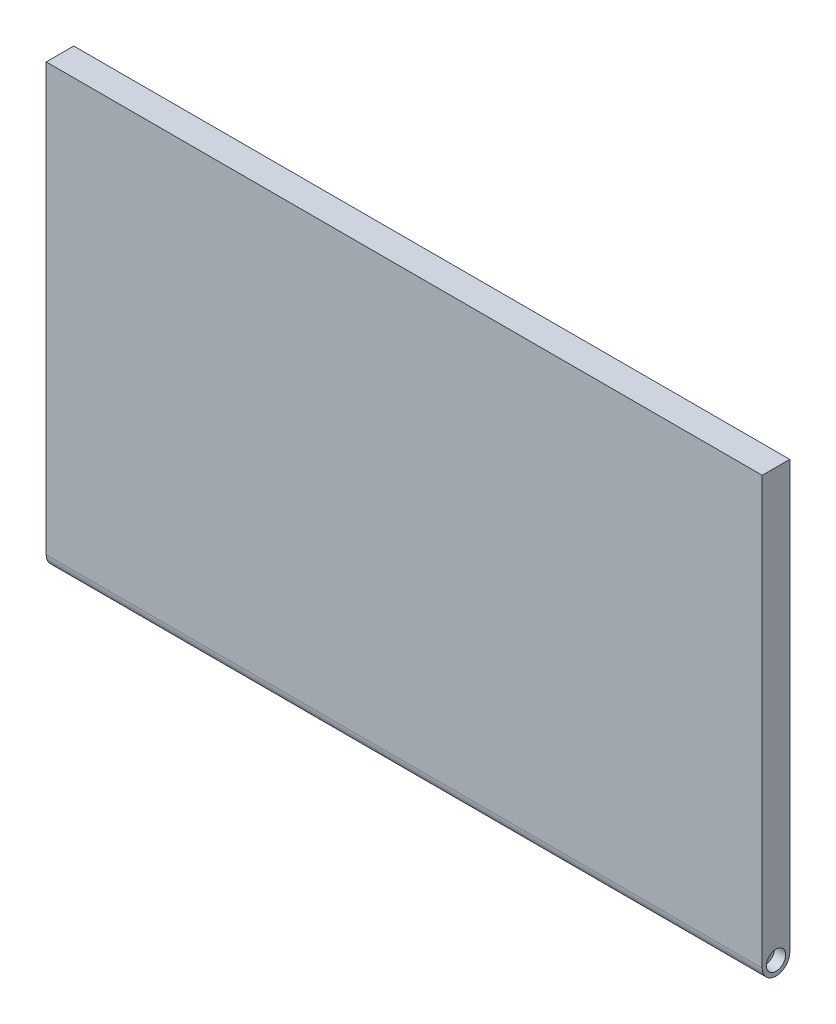
ISO-10303-21;
HEADER;
FILE_DESCRIPTION(('STEP AP214'),'2;1');
FILE_NAME('part.step','',(''),(''),'','','');
FILE_SCHEMA(('AUTOMOTIVE_DESIGN { 1 0 10303 214 1 1 1 1 }'));
ENDSEC;
DATA;
#1=APPLICATION_CONTEXT('core data for automotive mechanical design processes');
#2=APPLICATION_PROTOCOL_DEFINITION('international standard','automotive_design',2000,#1);
#3=PRODUCT_CONTEXT('',#1,'mechanical');
#4=PRODUCT('Part','Part','',(#3));
#5=PRODUCT_RELATED_PRODUCT_CATEGORY('part','',(#4));
#6=PRODUCT_DEFINITION_FORMATION('','',#4);
#7=PRODUCT_DEFINITION_CONTEXT('part definition',#1,'design');
#8=PRODUCT_DEFINITION('design','',#6,#7);
#9=PRODUCT_DEFINITION_SHAPE('','',#8);
#10=(LENGTH_UNIT() NAMED_UNIT(*) SI_UNIT(.MILLI.,.METRE.));
#11=(NAMED_UNIT(*) PLANE_ANGLE_UNIT() SI_UNIT($,.RADIAN.));
#12=(NAMED_UNIT(*) SI_UNIT($,.STERADIAN.) SOLID_ANGLE_UNIT());
#13=UNCERTAINTY_MEASURE_WITH_UNIT(LENGTH_MEASURE(1.E-05),#10,'distance_accuracy_value','');
#14=(GEOMETRIC_REPRESENTATION_CONTEXT(3) GLOBAL_UNCERTAINTY_ASSIGNED_CONTEXT((#13)) GLOBAL_UNIT_ASSIGNED_CONTEXT((#10,
#11,#12)) REPRESENTATION_CONTEXT('',''));
#15=CARTESIAN_POINT('',(0.,0.,0.));
#16=DIRECTION('',(0.,0.,1.));
#17=DIRECTION('',(1.,0.,0.));
#18=AXIS2_PLACEMENT_3D('',#15,#16,#17);
#19=CARTESIAN_POINT('',(65.,-40.,5.));
#20=DIRECTION('',(-1.,0.,0.));
#21=DIRECTION('',(0.,0.,1.));
#22=AXIS2_PLACEMENT_3D('',#19,#20,#21);
#23=PLANE('',#22);
#24=CARTESIAN_POINT('',(65.,-37.5,2.5));
#25=DIRECTION('',(1.,0.,0.));
#26=DIRECTION('',(0.,0.,-1.));
#27=AXIS2_PLACEMENT_3D('',#24,#25,#26);
#28=CIRCLE('',#27,1.75);
#29=CARTESIAN_POINT('',(65.,-37.5,0.75));
#30=VERTEX_POINT('',#29);
#31=EDGE_CURVE('E142',#30,#30,#28,.T.);
#32=ORIENTED_EDGE('',*,*,#31,.F.);
#33=EDGE_LOOP('',(#32));
#34=FACE_BOUND('',#33,.T.);
#35=CARTESIAN_POINT('',(65.,-37.5,2.5));
#36=DIRECTION('',(-1.,0.,0.));
#37=DIRECTION('',(0.,0.,1.));
#38=AXIS2_PLACEMENT_3D('',#35,#36,#37);
#39=CIRCLE('',#38,2.5);
#40=CARTESIAN_POINT('',(65.,-37.5,5.));
#41=VERTEX_POINT('',#40);
#42=CARTESIAN_POINT('',(65.,-40.,2.5));
#43=VERTEX_POINT('',#42);
#44=EDGE_CURVE('E108',#41,#43,#39,.F.);
#45=ORIENTED_EDGE('',*,*,#44,.T.);
#46=CARTESIAN_POINT('',(65.,-37.5,2.5));
#47=DIRECTION('',(-1.,0.,0.));
#48=DIRECTION('',(0.,0.,1.));
#49=AXIS2_PLACEMENT_3D('',#46,#47,#48);
#50=CIRCLE('',#49,2.5);
#51=CARTESIAN_POINT('',(65.,-37.5,0.));
#52=VERTEX_POINT('',#51);
#53=EDGE_CURVE('E112',#43,#52,#50,.F.);
#54=ORIENTED_EDGE('',*,*,#53,.T.);
#55=DIRECTION('',(0.,1.,0.));
#56=VECTOR('',#55,1.);
#57=CARTESIAN_POINT('',(65.,-40.,0.));
#58=LINE('',#57,#56);
#59=CARTESIAN_POINT('',(65.,40.,0.));
#60=VERTEX_POINT('',#59);
#61=EDGE_CURVE('E105',#52,#60,#58,.T.);
#62=ORIENTED_EDGE('',*,*,#61,.T.);
#63=DIRECTION('',(0.,0.,-1.));
#64=VECTOR('',#63,1.);
#65=CARTESIAN_POINT('',(65.,40.,5.));
#66=LINE('',#65,#64);
#67=CARTESIAN_POINT('',(65.,40.,5.));
#68=VERTEX_POINT('',#67);
#69=EDGE_CURVE('E98',#68,#60,#66,.T.);
#70=ORIENTED_EDGE('',*,*,#69,.F.);
#71=DIRECTION('',(0.,1.,0.));
#72=VECTOR('',#71,1.);
#73=CARTESIAN_POINT('',(65.,-40.,5.));
#74=LINE('',#73,#72);
#75=EDGE_CURVE('E83',#41,#68,#74,.T.);
#76=ORIENTED_EDGE('',*,*,#75,.F.);
#77=EDGE_LOOP('',(#45,#54,#62,#70,#76));
#78=FACE_BOUND('',#77,.T.);
#79=ADVANCED_FACE('F38',(#34,#78),#23,.F.);
#80=CARTESIAN_POINT('',(-65.,40.,5.));
#81=DIRECTION('',(0.,-1.,0.));
#82=DIRECTION('',(0.,0.,-1.));
#83=AXIS2_PLACEMENT_3D('',#80,#81,#82);
#84=PLANE('',#83);
#85=DIRECTION('',(-1.,0.,0.));
#86=VECTOR('',#85,1.);
#87=CARTESIAN_POINT('',(-65.,40.,0.));
#88=LINE('',#87,#86);
#89=CARTESIAN_POINT('',(-65.,40.,0.));
#90=VERTEX_POINT('',#89);
#91=EDGE_CURVE('E134',#60,#90,#88,.T.);
#92=ORIENTED_EDGE('',*,*,#91,.T.);
#93=DIRECTION('',(0.,0.,-1.));
#94=VECTOR('',#93,1.);
#95=CARTESIAN_POINT('',(-65.,40.,5.));
#96=LINE('',#95,#94);
#97=CARTESIAN_POINT('',(-65.,40.,5.));
#98=VERTEX_POINT('',#97);
#99=EDGE_CURVE('E100',#98,#90,#96,.T.);
#100=ORIENTED_EDGE('',*,*,#99,.F.);
#101=DIRECTION('',(-1.,0.,0.));
#102=VECTOR('',#101,1.);
#103=CARTESIAN_POINT('',(-65.,40.,5.));
#104=LINE('',#103,#102);
#105=EDGE_CURVE('E86',#68,#98,#104,.T.);
#106=ORIENTED_EDGE('',*,*,#105,.F.);
#107=ORIENTED_EDGE('',*,*,#69,.T.);
#108=EDGE_LOOP('',(#92,#100,#106,#107));
#109=FACE_BOUND('',#108,.T.);
#110=ADVANCED_FACE('F97',(#109),#84,.F.);
#111=CARTESIAN_POINT('',(-65.,-40.,5.));
#112=DIRECTION('',(1.,0.,0.));
#113=DIRECTION('',(0.,0.,-1.));
#114=AXIS2_PLACEMENT_3D('',#111,#112,#113);
#115=PLANE('',#114);
#116=DIRECTION('',(0.,-1.,0.));
#117=VECTOR('',#116,1.);
#118=CARTESIAN_POINT('',(-65.,-40.,0.));
#119=LINE('',#118,#117);
#120=CARTESIAN_POINT('',(-65.,-37.5,0.));
#121=VERTEX_POINT('',#120);
#122=EDGE_CURVE('E93',#90,#121,#119,.T.);
#123=ORIENTED_EDGE('',*,*,#122,.T.);
#124=CARTESIAN_POINT('',(-65.,-37.5,2.5));
#125=DIRECTION('',(1.,0.,0.));
#126=DIRECTION('',(0.,0.,-1.));
#127=AXIS2_PLACEMENT_3D('',#124,#125,#126);
#128=CIRCLE('',#127,2.5);
#129=CARTESIAN_POINT('',(-65.,-40.,2.5));
#130=VERTEX_POINT('',#129);
#131=EDGE_CURVE('E48',#121,#130,#128,.F.);
#132=ORIENTED_EDGE('',*,*,#131,.T.);
#133=CARTESIAN_POINT('',(-65.,-37.5,2.5));
#134=DIRECTION('',(1.,0.,0.));
#135=DIRECTION('',(0.,0.,-1.));
#136=AXIS2_PLACEMENT_3D('',#133,#134,#135);
#137=CIRCLE('',#136,2.5);
#138=CARTESIAN_POINT('',(-65.,-37.5,5.));
#139=VERTEX_POINT('',#138);
#140=EDGE_CURVE('E55',#130,#139,#137,.F.);
#141=ORIENTED_EDGE('',*,*,#140,.T.);
#142=DIRECTION('',(0.,-1.,0.));
#143=VECTOR('',#142,1.);
#144=CARTESIAN_POINT('',(-65.,-40.,5.));
#145=LINE('',#144,#143);
#146=EDGE_CURVE('E102',#98,#139,#145,.T.);
#147=ORIENTED_EDGE('',*,*,#146,.F.);
#148=ORIENTED_EDGE('',*,*,#99,.T.);
#149=EDGE_LOOP('',(#123,#132,#141,#147,#148));
#150=FACE_BOUND('',#149,.T.);
#151=ADVANCED_FACE('F132',(#150),#115,.F.);
#152=CARTESIAN_POINT('',(0.,0.,5.));
#153=DIRECTION('',(0.,0.,-1.));
#154=DIRECTION('',(-1.,0.,0.));
#155=AXIS2_PLACEMENT_3D('',#152,#153,#154);
#156=PLANE('',#155);
#157=ORIENTED_EDGE('',*,*,#146,.T.);
#158=DIRECTION('',(1.,0.,0.));
#159=VECTOR('',#158,1.);
#160=CARTESIAN_POINT('',(0.,-37.5,5.));
#161=LINE('',#160,#159);
#162=EDGE_CURVE('E11',#139,#41,#161,.T.);
#163=ORIENTED_EDGE('',*,*,#162,.T.);
#164=ORIENTED_EDGE('',*,*,#75,.T.);
#165=ORIENTED_EDGE('',*,*,#105,.T.);
#166=EDGE_LOOP('',(#157,#163,#164,#165));
#167=FACE_BOUND('',#166,.T.);
#168=ADVANCED_FACE('F85',(#167),#156,.F.);
#169=CARTESIAN_POINT('',(0.,0.,0.));
#170=DIRECTION('',(0.,0.,-1.));
#171=DIRECTION('',(-1.,0.,0.));
#172=AXIS2_PLACEMENT_3D('',#169,#170,#171);
#173=PLANE('',#172);
#174=ORIENTED_EDGE('',*,*,#61,.F.);
#175=DIRECTION('',(1.,0.,0.));
#176=VECTOR('',#175,1.);
#177=CARTESIAN_POINT('',(-65.,-37.5,0.));
#178=LINE('',#177,#176);
#179=EDGE_CURVE('E119',#52,#121,#178,.F.);
#180=ORIENTED_EDGE('',*,*,#179,.T.);
#181=ORIENTED_EDGE('',*,*,#122,.F.);
#182=ORIENTED_EDGE('',*,*,#91,.F.);
#183=EDGE_LOOP('',(#174,#180,#181,#182));
#184=FACE_BOUND('',#183,.T.);
#185=ADVANCED_FACE('F129',(#184),#173,.T.);
#186=CARTESIAN_POINT('',(0.,-37.5,2.5));
#187=DIRECTION('',(1.,0.,0.));
#188=DIRECTION('',(0.,0.,-1.));
#189=AXIS2_PLACEMENT_3D('',#186,#187,#188);
#190=CYLINDRICAL_SURFACE('',#189,2.5);
#191=ORIENTED_EDGE('',*,*,#162,.F.);
#192=ORIENTED_EDGE('',*,*,#140,.F.);
#193=DIRECTION('',(1.,0.,0.));
#194=VECTOR('',#193,1.);
#195=CARTESIAN_POINT('',(-65.,-40.,2.5));
#196=LINE('',#195,#194);
#197=EDGE_CURVE('E42',#43,#130,#196,.F.);
#198=ORIENTED_EDGE('',*,*,#197,.F.);
#199=ORIENTED_EDGE('',*,*,#44,.F.);
#200=EDGE_LOOP('',(#191,#192,#198,#199));
#201=FACE_BOUND('',#200,.T.);
#202=ADVANCED_FACE('F40',(#201),#190,.T.);
#203=CARTESIAN_POINT('',(-65.,-37.5,2.5));
#204=DIRECTION('',(-1.,0.,0.));
#205=DIRECTION('',(0.,0.,1.));
#206=AXIS2_PLACEMENT_3D('',#203,#204,#205);
#207=CYLINDRICAL_SURFACE('',#206,2.5);
#208=ORIENTED_EDGE('',*,*,#131,.F.);
#209=ORIENTED_EDGE('',*,*,#179,.F.);
#210=ORIENTED_EDGE('',*,*,#53,.F.);
#211=ORIENTED_EDGE('',*,*,#197,.T.);
#212=EDGE_LOOP('',(#208,#209,#210,#211));
#213=FACE_BOUND('',#212,.T.);
#214=ADVANCED_FACE('F154',(#213),#207,.T.);
#215=CARTESIAN_POINT('',(63.,-37.5,2.5));
#216=DIRECTION('',(1.,0.,0.));
#217=DIRECTION('',(0.,0.,-1.));
#218=AXIS2_PLACEMENT_3D('',#215,#216,#217);
#219=CYLINDRICAL_SURFACE('',#218,1.75);
#220=CARTESIAN_POINT('',(63.,-37.5,2.5));
#221=DIRECTION('',(1.,0.,0.));
#222=DIRECTION('',(0.,0.,-1.));
#223=AXIS2_PLACEMENT_3D('',#220,#221,#222);
#224=CIRCLE('',#223,1.75);
#225=CARTESIAN_POINT('',(63.,-37.5,0.75));
#226=VERTEX_POINT('',#225);
#227=EDGE_CURVE('E146',#226,#226,#224,.T.);
#228=ORIENTED_EDGE('',*,*,#227,.F.);
#229=EDGE_LOOP('',(#228));
#230=FACE_BOUND('',#229,.T.);
#231=ORIENTED_EDGE('',*,*,#31,.T.);
#232=EDGE_LOOP('',(#231));
#233=FACE_BOUND('',#232,.T.);
#234=ADVANCED_FACE('F161',(#230,#233),#219,.F.);
#235=CARTESIAN_POINT('',(63.,-37.5,2.5));
#236=DIRECTION('',(1.,0.,0.));
#237=DIRECTION('',(0.,0.,-1.));
#238=AXIS2_PLACEMENT_3D('',#235,#236,#237);
#239=PLANE('',#238);
#240=ORIENTED_EDGE('',*,*,#227,.T.);
#241=EDGE_LOOP('',(#240));
#242=FACE_BOUND('',#241,.T.);
#243=ADVANCED_FACE('F180',(#242),#239,.T.);
#244=CLOSED_SHELL('',(#79,#110,#151,#168,#185,#202,#214,#234,#243));
#245=MANIFOLD_SOLID_BREP('B2',#244);
#246=ADVANCED_BREP_SHAPE_REPRESENTATION('',(#18,#245),#14);
#247=SHAPE_DEFINITION_REPRESENTATION(#9,#246);
ENDSEC;
END-ISO-10303-21;
